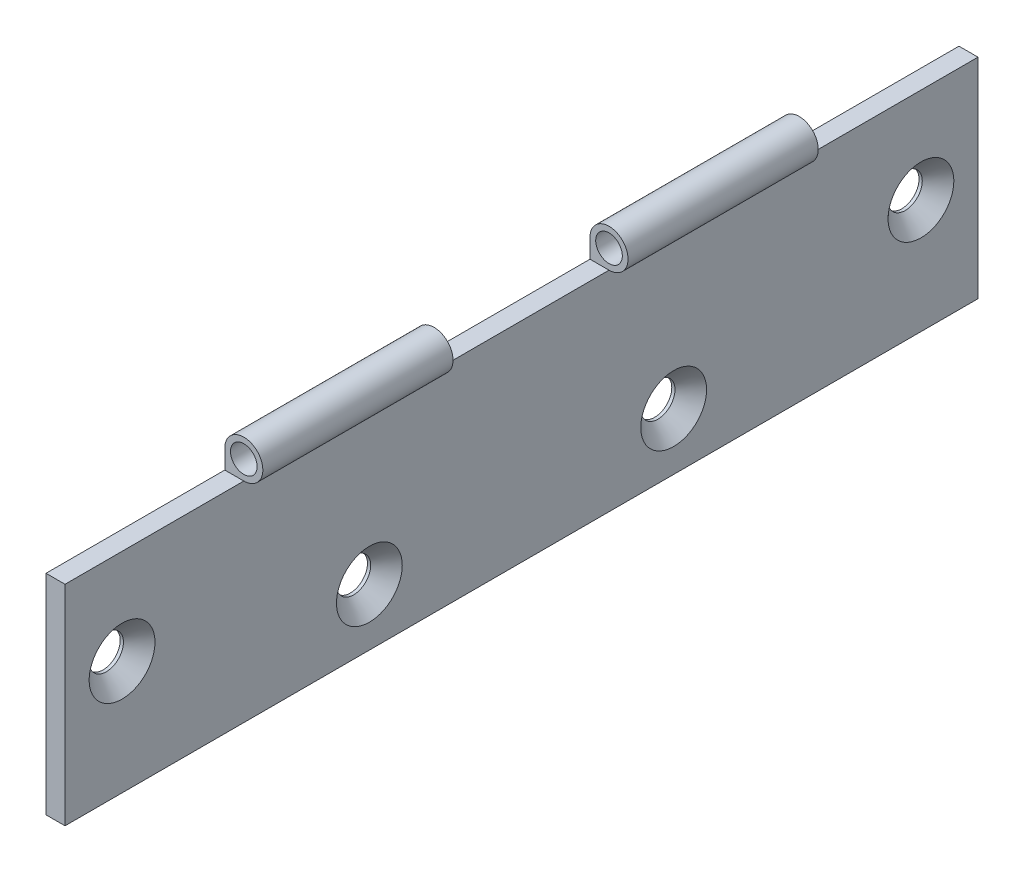
ISO-10303-21;
HEADER;
FILE_DESCRIPTION(('STEP AP214'),'2;1');
FILE_NAME('part.step','',(''),(''),'','','');
FILE_SCHEMA(('AUTOMOTIVE_DESIGN { 1 0 10303 214 1 1 1 1 }'));
ENDSEC;
DATA;
#1=APPLICATION_CONTEXT('core data for automotive mechanical design processes');
#2=APPLICATION_PROTOCOL_DEFINITION('international standard','automotive_design',2000,#1);
#3=PRODUCT_CONTEXT('',#1,'mechanical');
#4=PRODUCT('Part','Part','',(#3));
#5=PRODUCT_RELATED_PRODUCT_CATEGORY('part','',(#4));
#6=PRODUCT_DEFINITION_FORMATION('','',#4);
#7=PRODUCT_DEFINITION_CONTEXT('part definition',#1,'design');
#8=PRODUCT_DEFINITION('design','',#6,#7);
#9=PRODUCT_DEFINITION_SHAPE('','',#8);
#10=(LENGTH_UNIT() NAMED_UNIT(*) SI_UNIT(.MILLI.,.METRE.));
#11=(NAMED_UNIT(*) PLANE_ANGLE_UNIT() SI_UNIT($,.RADIAN.));
#12=(NAMED_UNIT(*) SI_UNIT($,.STERADIAN.) SOLID_ANGLE_UNIT());
#13=UNCERTAINTY_MEASURE_WITH_UNIT(LENGTH_MEASURE(1.E-05),#10,'distance_accuracy_value','');
#14=(GEOMETRIC_REPRESENTATION_CONTEXT(3) GLOBAL_UNCERTAINTY_ASSIGNED_CONTEXT((#13)) GLOBAL_UNIT_ASSIGNED_CONTEXT((#10,
#11,#12)) REPRESENTATION_CONTEXT('',''));
#15=CARTESIAN_POINT('',(0.,0.,0.));
#16=DIRECTION('',(0.,0.,1.));
#17=DIRECTION('',(1.,0.,0.));
#18=AXIS2_PLACEMENT_3D('',#15,#16,#17);
#19=CARTESIAN_POINT('',(0.,0.,120.));
#20=DIRECTION('',(-1.,0.,0.));
#21=DIRECTION('',(0.,0.,1.));
#22=AXIS2_PLACEMENT_3D('',#19,#20,#21);
#23=PLANE('',#22);
#24=CARTESIAN_POINT('',(0.,30.,-105.));
#25=DIRECTION('',(1.,0.,0.));
#26=DIRECTION('',(0.,0.,-1.));
#27=AXIS2_PLACEMENT_3D('',#24,#25,#26);
#28=CIRCLE('',#27,4.5);
#29=CARTESIAN_POINT('',(0.,30.,-109.5));
#30=VERTEX_POINT('',#29);
#31=EDGE_CURVE('E191',#30,#30,#28,.T.);
#32=ORIENTED_EDGE('',*,*,#31,.T.);
#33=EDGE_LOOP('',(#32));
#34=FACE_BOUND('',#33,.T.);
#35=CARTESIAN_POINT('',(0.,15.,-40.));
#36=DIRECTION('',(1.,0.,0.));
#37=DIRECTION('',(0.,0.,-1.));
#38=AXIS2_PLACEMENT_3D('',#35,#36,#37);
#39=CIRCLE('',#38,4.5);
#40=CARTESIAN_POINT('',(0.,15.,-44.5));
#41=VERTEX_POINT('',#40);
#42=EDGE_CURVE('E200',#41,#41,#39,.T.);
#43=ORIENTED_EDGE('',*,*,#42,.T.);
#44=EDGE_LOOP('',(#43));
#45=FACE_BOUND('',#44,.T.);
#46=CARTESIAN_POINT('',(0.,30.,105.));
#47=DIRECTION('',(1.,0.,0.));
#48=DIRECTION('',(0.,0.,-1.));
#49=AXIS2_PLACEMENT_3D('',#46,#47,#48);
#50=CIRCLE('',#49,4.5);
#51=CARTESIAN_POINT('',(0.,30.,100.5));
#52=VERTEX_POINT('',#51);
#53=EDGE_CURVE('E209',#52,#52,#50,.T.);
#54=ORIENTED_EDGE('',*,*,#53,.T.);
#55=EDGE_LOOP('',(#54));
#56=FACE_BOUND('',#55,.T.);
#57=CARTESIAN_POINT('',(0.,15.,40.));
#58=DIRECTION('',(1.,0.,0.));
#59=DIRECTION('',(0.,0.,-1.));
#60=AXIS2_PLACEMENT_3D('',#57,#58,#59);
#61=CIRCLE('',#60,4.5);
#62=CARTESIAN_POINT('',(0.,15.,35.5));
#63=VERTEX_POINT('',#62);
#64=EDGE_CURVE('E218',#63,#63,#61,.T.);
#65=ORIENTED_EDGE('',*,*,#64,.T.);
#66=EDGE_LOOP('',(#65));
#67=FACE_BOUND('',#66,.T.);
#68=DIRECTION('',(0.,0.,1.));
#69=VECTOR('',#68,1.);
#70=CARTESIAN_POINT('',(0.,55.,0.));
#71=LINE('',#70,#69);
#72=CARTESIAN_POINT('',(0.,55.,73.));
#73=VERTEX_POINT('',#72);
#74=CARTESIAN_POINT('',(0.,55.,120.));
#75=VERTEX_POINT('',#74);
#76=EDGE_CURVE('E114',#73,#75,#71,.T.);
#77=ORIENTED_EDGE('',*,*,#76,.F.);
#78=DIRECTION('',(0.,-1.,0.));
#79=VECTOR('',#78,1.);
#80=CARTESIAN_POINT('',(0.,0.,73.0000000000001));
#81=LINE('',#80,#79);
#82=CARTESIAN_POINT('',(0.,60.,73.));
#83=VERTEX_POINT('',#82);
#84=EDGE_CURVE('E121',#83,#73,#81,.T.);
#85=ORIENTED_EDGE('',*,*,#84,.F.);
#86=DIRECTION('',(0.,0.,-1.));
#87=VECTOR('',#86,1.);
#88=CARTESIAN_POINT('',(0.,60.,120.));
#89=LINE('',#88,#87);
#90=CARTESIAN_POINT('',(0.,60.,23.));
#91=VERTEX_POINT('',#90);
#92=EDGE_CURVE('E11',#83,#91,#89,.T.);
#93=ORIENTED_EDGE('',*,*,#92,.T.);
#94=DIRECTION('',(0.,-1.,0.));
#95=VECTOR('',#94,1.);
#96=CARTESIAN_POINT('',(0.,0.,23.));
#97=LINE('',#96,#95);
#98=CARTESIAN_POINT('',(0.,55.,23.));
#99=VERTEX_POINT('',#98);
#100=EDGE_CURVE('E244',#91,#99,#97,.T.);
#101=ORIENTED_EDGE('',*,*,#100,.T.);
#102=DIRECTION('',(0.,0.,1.));
#103=VECTOR('',#102,1.);
#104=CARTESIAN_POINT('',(0.,55.,0.));
#105=LINE('',#104,#103);
#106=CARTESIAN_POINT('',(0.,55.,-23.));
#107=VERTEX_POINT('',#106);
#108=EDGE_CURVE('E241',#107,#99,#105,.T.);
#109=ORIENTED_EDGE('',*,*,#108,.F.);
#110=DIRECTION('',(0.,-1.,0.));
#111=VECTOR('',#110,1.);
#112=CARTESIAN_POINT('',(0.,0.,-23.));
#113=LINE('',#112,#111);
#114=CARTESIAN_POINT('',(0.,60.,-23.));
#115=VERTEX_POINT('',#114);
#116=EDGE_CURVE('E240',#115,#107,#113,.T.);
#117=ORIENTED_EDGE('',*,*,#116,.F.);
#118=CARTESIAN_POINT('',(0.,60.,-73.));
#119=VERTEX_POINT('',#118);
#120=EDGE_CURVE('E43',#115,#119,#89,.T.);
#121=ORIENTED_EDGE('',*,*,#120,.T.);
#122=DIRECTION('',(0.,-1.,0.));
#123=VECTOR('',#122,1.);
#124=CARTESIAN_POINT('',(0.,0.,-73.0000000000001));
#125=LINE('',#124,#123);
#126=CARTESIAN_POINT('',(0.,55.,-73.));
#127=VERTEX_POINT('',#126);
#128=EDGE_CURVE('E163',#119,#127,#125,.T.);
#129=ORIENTED_EDGE('',*,*,#128,.T.);
#130=DIRECTION('',(0.,0.,1.));
#131=VECTOR('',#130,1.);
#132=CARTESIAN_POINT('',(0.,55.,0.));
#133=LINE('',#132,#131);
#134=CARTESIAN_POINT('',(0.,55.,-120.));
#135=VERTEX_POINT('',#134);
#136=EDGE_CURVE('E177',#135,#127,#133,.T.);
#137=ORIENTED_EDGE('',*,*,#136,.F.);
#138=DIRECTION('',(0.,1.,0.));
#139=VECTOR('',#138,1.);
#140=CARTESIAN_POINT('',(0.,0.,-120.));
#141=LINE('',#140,#139);
#142=CARTESIAN_POINT('',(0.,0.,-120.));
#143=VERTEX_POINT('',#142);
#144=EDGE_CURVE('E141',#143,#135,#141,.T.);
#145=ORIENTED_EDGE('',*,*,#144,.F.);
#146=DIRECTION('',(0.,0.,-1.));
#147=VECTOR('',#146,1.);
#148=CARTESIAN_POINT('',(0.,0.,120.));
#149=LINE('',#148,#147);
#150=CARTESIAN_POINT('',(0.,0.,120.));
#151=VERTEX_POINT('',#150);
#152=EDGE_CURVE('E60',#151,#143,#149,.T.);
#153=ORIENTED_EDGE('',*,*,#152,.F.);
#154=DIRECTION('',(0.,1.,0.));
#155=VECTOR('',#154,1.);
#156=CARTESIAN_POINT('',(0.,0.,120.));
#157=LINE('',#156,#155);
#158=EDGE_CURVE('E128',#151,#75,#157,.T.);
#159=ORIENTED_EDGE('',*,*,#158,.T.);
#160=EDGE_LOOP('',(#77,#85,#93,#101,#109,#117,#121,#129,#137,#145,#153,#159));
#161=FACE_BOUND('',#160,.T.);
#162=ADVANCED_FACE('F33',(#34,#45,#56,#67,#161),#23,.T.);
#163=CARTESIAN_POINT('',(0.,0.,120.));
#164=DIRECTION('',(0.,0.,-1.));
#165=DIRECTION('',(-1.,0.,0.));
#166=AXIS2_PLACEMENT_3D('',#163,#164,#165);
#167=PLANE('',#166);
#168=DIRECTION('',(1.,0.,0.));
#169=VECTOR('',#168,1.);
#170=CARTESIAN_POINT('',(0.,55.,120.));
#171=LINE('',#170,#169);
#172=CARTESIAN_POINT('',(5.,55.,120.));
#173=VERTEX_POINT('',#172);
#174=EDGE_CURVE('E68',#75,#173,#171,.T.);
#175=ORIENTED_EDGE('',*,*,#174,.F.);
#176=ORIENTED_EDGE('',*,*,#158,.F.);
#177=DIRECTION('',(-1.,0.,0.));
#178=VECTOR('',#177,1.);
#179=CARTESIAN_POINT('',(5.,0.,120.));
#180=LINE('',#179,#178);
#181=CARTESIAN_POINT('',(5.,0.,120.));
#182=VERTEX_POINT('',#181);
#183=EDGE_CURVE('E131',#182,#151,#180,.T.);
#184=ORIENTED_EDGE('',*,*,#183,.F.);
#185=DIRECTION('',(0.,1.,0.));
#186=VECTOR('',#185,1.);
#187=CARTESIAN_POINT('',(5.,0.,120.));
#188=LINE('',#187,#186);
#189=EDGE_CURVE('E129',#182,#173,#188,.T.);
#190=ORIENTED_EDGE('',*,*,#189,.T.);
#191=EDGE_LOOP('',(#175,#176,#184,#190));
#192=FACE_BOUND('',#191,.T.);
#193=ADVANCED_FACE('F126',(#192),#167,.F.);
#194=CARTESIAN_POINT('',(5.,60.,-120.));
#195=DIRECTION('',(0.,0.,1.));
#196=DIRECTION('',(1.,0.,0.));
#197=AXIS2_PLACEMENT_3D('',#194,#195,#196);
#198=CYLINDRICAL_SURFACE('',#197,5.);
#199=ORIENTED_EDGE('',*,*,#92,.F.);
#200=CARTESIAN_POINT('',(5.,60.,73.));
#201=DIRECTION('',(0.,0.,1.));
#202=DIRECTION('',(0.,-1.,0.));
#203=AXIS2_PLACEMENT_3D('',#200,#201,#202);
#204=CIRCLE('',#203,5.);
#205=CARTESIAN_POINT('',(5.,55.,73.));
#206=VERTEX_POINT('',#205);
#207=EDGE_CURVE('E248',#83,#206,#204,.F.);
#208=ORIENTED_EDGE('',*,*,#207,.T.);
#209=DIRECTION('',(0.,0.,1.));
#210=VECTOR('',#209,1.);
#211=CARTESIAN_POINT('',(5.,55.,-120.));
#212=LINE('',#211,#210);
#213=CARTESIAN_POINT('',(5.,55.,23.));
#214=VERTEX_POINT('',#213);
#215=EDGE_CURVE('E226',#214,#206,#212,.T.);
#216=ORIENTED_EDGE('',*,*,#215,.F.);
#217=CARTESIAN_POINT('',(5.,60.,23.));
#218=DIRECTION('',(0.,0.,1.));
#219=DIRECTION('',(1.,0.,0.));
#220=AXIS2_PLACEMENT_3D('',#217,#218,#219);
#221=CIRCLE('',#220,5.);
#222=EDGE_CURVE('E156',#91,#214,#221,.F.);
#223=ORIENTED_EDGE('',*,*,#222,.F.);
#224=EDGE_LOOP('',(#199,#208,#216,#223));
#225=FACE_BOUND('',#224,.T.);
#226=ADVANCED_FACE('F256',(#225),#198,.T.);
#227=CARTESIAN_POINT('',(5.,60.,-120.));
#228=DIRECTION('',(0.,0.,1.));
#229=DIRECTION('',(1.,0.,0.));
#230=AXIS2_PLACEMENT_3D('',#227,#228,#229);
#231=CYLINDRICAL_SURFACE('',#230,3.5);
#232=CARTESIAN_POINT('',(5.,60.,23.));
#233=DIRECTION('',(0.,0.,1.));
#234=DIRECTION('',(1.,0.,0.));
#235=AXIS2_PLACEMENT_3D('',#232,#233,#234);
#236=CIRCLE('',#235,3.5);
#237=CARTESIAN_POINT('',(8.5,60.,23.));
#238=VERTEX_POINT('',#237);
#239=EDGE_CURVE('E154',#238,#238,#236,.F.);
#240=ORIENTED_EDGE('',*,*,#239,.T.);
#241=EDGE_LOOP('',(#240));
#242=FACE_BOUND('',#241,.T.);
#243=CARTESIAN_POINT('',(5.,60.,73.));
#244=DIRECTION('',(0.,0.,1.));
#245=DIRECTION('',(0.,-1.,0.));
#246=AXIS2_PLACEMENT_3D('',#243,#244,#245);
#247=CIRCLE('',#246,3.5);
#248=CARTESIAN_POINT('',(5.,56.5,73.));
#249=VERTEX_POINT('',#248);
#250=EDGE_CURVE('E37',#249,#249,#247,.F.);
#251=ORIENTED_EDGE('',*,*,#250,.F.);
#252=EDGE_LOOP('',(#251));
#253=FACE_BOUND('',#252,.T.);
#254=ADVANCED_FACE('F317',(#242,#253),#231,.F.);
#255=ORIENTED_EDGE('',*,*,#120,.F.);
#256=CARTESIAN_POINT('',(5.,60.,-23.));
#257=DIRECTION('',(0.,0.,1.));
#258=DIRECTION('',(0.,-1.,0.));
#259=AXIS2_PLACEMENT_3D('',#256,#257,#258);
#260=CIRCLE('',#259,5.);
#261=CARTESIAN_POINT('',(5.,55.,-23.));
#262=VERTEX_POINT('',#261);
#263=EDGE_CURVE('E160',#115,#262,#260,.F.);
#264=ORIENTED_EDGE('',*,*,#263,.T.);
#265=CARTESIAN_POINT('',(5.,55.,-73.));
#266=VERTEX_POINT('',#265);
#267=EDGE_CURVE('E222',#266,#262,#212,.T.);
#268=ORIENTED_EDGE('',*,*,#267,.F.);
#269=CARTESIAN_POINT('',(5.,60.,-73.));
#270=DIRECTION('',(0.,0.,1.));
#271=DIRECTION('',(0.,-1.,0.));
#272=AXIS2_PLACEMENT_3D('',#269,#270,#271);
#273=CIRCLE('',#272,5.);
#274=EDGE_CURVE('E152',#119,#266,#273,.F.);
#275=ORIENTED_EDGE('',*,*,#274,.F.);
#276=EDGE_LOOP('',(#255,#264,#268,#275));
#277=FACE_BOUND('',#276,.T.);
#278=ADVANCED_FACE('F263',(#277),#198,.T.);
#279=CARTESIAN_POINT('',(5.,60.,-73.));
#280=DIRECTION('',(0.,0.,1.));
#281=DIRECTION('',(0.,-1.,0.));
#282=AXIS2_PLACEMENT_3D('',#279,#280,#281);
#283=CIRCLE('',#282,3.5);
#284=CARTESIAN_POINT('',(5.,56.5,-73.));
#285=VERTEX_POINT('',#284);
#286=EDGE_CURVE('E149',#285,#285,#283,.F.);
#287=ORIENTED_EDGE('',*,*,#286,.T.);
#288=EDGE_LOOP('',(#287));
#289=FACE_BOUND('',#288,.T.);
#290=CARTESIAN_POINT('',(5.,60.,-23.));
#291=DIRECTION('',(0.,0.,1.));
#292=DIRECTION('',(0.,-1.,0.));
#293=AXIS2_PLACEMENT_3D('',#290,#291,#292);
#294=CIRCLE('',#293,3.5);
#295=CARTESIAN_POINT('',(5.,56.5,-23.));
#296=VERTEX_POINT('',#295);
#297=EDGE_CURVE('E158',#296,#296,#294,.F.);
#298=ORIENTED_EDGE('',*,*,#297,.F.);
#299=EDGE_LOOP('',(#298));
#300=FACE_BOUND('',#299,.T.);
#301=ADVANCED_FACE('F321',(#289,#300),#231,.F.);
#302=CARTESIAN_POINT('',(0.,0.,-120.));
#303=DIRECTION('',(0.,0.,-1.));
#304=DIRECTION('',(-1.,0.,0.));
#305=AXIS2_PLACEMENT_3D('',#302,#303,#304);
#306=PLANE('',#305);
#307=ORIENTED_EDGE('',*,*,#144,.T.);
#308=DIRECTION('',(1.,0.,0.));
#309=VECTOR('',#308,1.);
#310=CARTESIAN_POINT('',(0.,55.,-120.));
#311=LINE('',#310,#309);
#312=CARTESIAN_POINT('',(5.,55.,-120.));
#313=VERTEX_POINT('',#312);
#314=EDGE_CURVE('E153',#135,#313,#311,.T.);
#315=ORIENTED_EDGE('',*,*,#314,.T.);
#316=DIRECTION('',(0.,1.,0.));
#317=VECTOR('',#316,1.);
#318=CARTESIAN_POINT('',(5.,0.,-120.));
#319=LINE('',#318,#317);
#320=CARTESIAN_POINT('',(5.,0.,-120.));
#321=VERTEX_POINT('',#320);
#322=EDGE_CURVE('E138',#321,#313,#319,.T.);
#323=ORIENTED_EDGE('',*,*,#322,.F.);
#324=DIRECTION('',(-1.,0.,0.));
#325=VECTOR('',#324,1.);
#326=CARTESIAN_POINT('',(5.,0.,-120.));
#327=LINE('',#326,#325);
#328=EDGE_CURVE('E134',#321,#143,#327,.T.);
#329=ORIENTED_EDGE('',*,*,#328,.T.);
#330=EDGE_LOOP('',(#307,#315,#323,#329));
#331=FACE_BOUND('',#330,.T.);
#332=ADVANCED_FACE('F272',(#331),#306,.T.);
#333=CARTESIAN_POINT('',(5.,0.,120.));
#334=DIRECTION('',(-1.,0.,0.));
#335=DIRECTION('',(0.,0.,1.));
#336=AXIS2_PLACEMENT_3D('',#333,#334,#335);
#337=PLANE('',#336);
#338=CARTESIAN_POINT('',(5.,30.,-105.));
#339=DIRECTION('',(1.,0.,0.));
#340=DIRECTION('',(0.,0.,-1.));
#341=AXIS2_PLACEMENT_3D('',#338,#339,#340);
#342=CIRCLE('',#341,8.65);
#343=CARTESIAN_POINT('',(5.,30.,-113.65));
#344=VERTEX_POINT('',#343);
#345=EDGE_CURVE('E185',#344,#344,#342,.T.);
#346=ORIENTED_EDGE('',*,*,#345,.F.);
#347=EDGE_LOOP('',(#346));
#348=FACE_BOUND('',#347,.T.);
#349=CARTESIAN_POINT('',(5.,15.,-40.));
#350=DIRECTION('',(1.,0.,0.));
#351=DIRECTION('',(0.,0.,-1.));
#352=AXIS2_PLACEMENT_3D('',#349,#350,#351);
#353=CIRCLE('',#352,8.65);
#354=CARTESIAN_POINT('',(5.,15.,-48.65));
#355=VERTEX_POINT('',#354);
#356=EDGE_CURVE('E194',#355,#355,#353,.T.);
#357=ORIENTED_EDGE('',*,*,#356,.F.);
#358=EDGE_LOOP('',(#357));
#359=FACE_BOUND('',#358,.T.);
#360=CARTESIAN_POINT('',(5.,30.,105.));
#361=DIRECTION('',(1.,0.,0.));
#362=DIRECTION('',(0.,0.,-1.));
#363=AXIS2_PLACEMENT_3D('',#360,#361,#362);
#364=CIRCLE('',#363,8.65);
#365=CARTESIAN_POINT('',(5.,30.,96.35));
#366=VERTEX_POINT('',#365);
#367=EDGE_CURVE('E203',#366,#366,#364,.T.);
#368=ORIENTED_EDGE('',*,*,#367,.F.);
#369=EDGE_LOOP('',(#368));
#370=FACE_BOUND('',#369,.T.);
#371=CARTESIAN_POINT('',(5.,15.,40.));
#372=DIRECTION('',(1.,0.,0.));
#373=DIRECTION('',(0.,0.,-1.));
#374=AXIS2_PLACEMENT_3D('',#371,#372,#373);
#375=CIRCLE('',#374,8.65);
#376=CARTESIAN_POINT('',(5.,15.,31.35));
#377=VERTEX_POINT('',#376);
#378=EDGE_CURVE('E212',#377,#377,#375,.T.);
#379=ORIENTED_EDGE('',*,*,#378,.F.);
#380=EDGE_LOOP('',(#379));
#381=FACE_BOUND('',#380,.T.);
#382=ORIENTED_EDGE('',*,*,#322,.T.);
#383=EDGE_CURVE('E142',#313,#266,#212,.T.);
#384=ORIENTED_EDGE('',*,*,#383,.T.);
#385=ORIENTED_EDGE('',*,*,#267,.T.);
#386=EDGE_CURVE('E225',#262,#214,#212,.T.);
#387=ORIENTED_EDGE('',*,*,#386,.T.);
#388=ORIENTED_EDGE('',*,*,#215,.T.);
#389=EDGE_CURVE('E220',#206,#173,#212,.T.);
#390=ORIENTED_EDGE('',*,*,#389,.T.);
#391=ORIENTED_EDGE('',*,*,#189,.F.);
#392=DIRECTION('',(0.,0.,-1.));
#393=VECTOR('',#392,1.);
#394=CARTESIAN_POINT('',(5.,0.,120.));
#395=LINE('',#394,#393);
#396=EDGE_CURVE('E52',#182,#321,#395,.T.);
#397=ORIENTED_EDGE('',*,*,#396,.T.);
#398=EDGE_LOOP('',(#382,#384,#385,#387,#388,#390,#391,#397));
#399=FACE_BOUND('',#398,.T.);
#400=ADVANCED_FACE('F35',(#348,#359,#370,#381,#399),#337,.F.);
#401=CARTESIAN_POINT('',(5.,0.,120.));
#402=DIRECTION('',(0.,-1.,0.));
#403=DIRECTION('',(0.,0.,-1.));
#404=AXIS2_PLACEMENT_3D('',#401,#402,#403);
#405=PLANE('',#404);
#406=ORIENTED_EDGE('',*,*,#328,.F.);
#407=ORIENTED_EDGE('',*,*,#396,.F.);
#408=ORIENTED_EDGE('',*,*,#183,.T.);
#409=ORIENTED_EDGE('',*,*,#152,.T.);
#410=EDGE_LOOP('',(#406,#407,#408,#409));
#411=FACE_BOUND('',#410,.T.);
#412=ADVANCED_FACE('F274',(#411),#405,.T.);
#413=CARTESIAN_POINT('',(5.,15.,40.));
#414=DIRECTION('',(1.,0.,0.));
#415=DIRECTION('',(0.,0.,-1.));
#416=AXIS2_PLACEMENT_3D('',#413,#414,#415);
#417=CYLINDRICAL_SURFACE('',#416,4.5);
#418=ORIENTED_EDGE('',*,*,#64,.F.);
#419=EDGE_LOOP('',(#418));
#420=FACE_BOUND('',#419,.T.);
#421=CARTESIAN_POINT('',(0.850000000000003,15.,40.));
#422=DIRECTION('',(1.,0.,0.));
#423=DIRECTION('',(0.,0.,-1.));
#424=AXIS2_PLACEMENT_3D('',#421,#422,#423);
#425=CIRCLE('',#424,4.5);
#426=CARTESIAN_POINT('',(0.850000000000003,15.,35.5));
#427=VERTEX_POINT('',#426);
#428=EDGE_CURVE('E215',#427,#427,#425,.T.);
#429=ORIENTED_EDGE('',*,*,#428,.T.);
#430=EDGE_LOOP('',(#429));
#431=FACE_BOUND('',#430,.T.);
#432=ADVANCED_FACE('F276',(#420,#431),#417,.F.);
#433=CARTESIAN_POINT('',(5.,15.,40.));
#434=DIRECTION('',(1.,0.,0.));
#435=DIRECTION('',(0.,0.,-1.));
#436=AXIS2_PLACEMENT_3D('',#433,#434,#435);
#437=CONICAL_SURFACE('',#436,8.65,0.785398163397448);
#438=ORIENTED_EDGE('',*,*,#428,.F.);
#439=EDGE_LOOP('',(#438));
#440=FACE_BOUND('',#439,.T.);
#441=ORIENTED_EDGE('',*,*,#378,.T.);
#442=EDGE_LOOP('',(#441));
#443=FACE_BOUND('',#442,.T.);
#444=ADVANCED_FACE('F282',(#440,#443),#437,.F.);
#445=CARTESIAN_POINT('',(5.,30.,105.));
#446=DIRECTION('',(1.,0.,0.));
#447=DIRECTION('',(0.,0.,-1.));
#448=AXIS2_PLACEMENT_3D('',#445,#446,#447);
#449=CYLINDRICAL_SURFACE('',#448,4.5);
#450=ORIENTED_EDGE('',*,*,#53,.F.);
#451=EDGE_LOOP('',(#450));
#452=FACE_BOUND('',#451,.T.);
#453=CARTESIAN_POINT('',(0.850000000000003,30.,105.));
#454=DIRECTION('',(1.,0.,0.));
#455=DIRECTION('',(0.,0.,-1.));
#456=AXIS2_PLACEMENT_3D('',#453,#454,#455);
#457=CIRCLE('',#456,4.5);
#458=CARTESIAN_POINT('',(0.850000000000003,30.,100.5));
#459=VERTEX_POINT('',#458);
#460=EDGE_CURVE('E206',#459,#459,#457,.T.);
#461=ORIENTED_EDGE('',*,*,#460,.T.);
#462=EDGE_LOOP('',(#461));
#463=FACE_BOUND('',#462,.T.);
#464=ADVANCED_FACE('F305',(#452,#463),#449,.F.);
#465=CARTESIAN_POINT('',(5.,30.,105.));
#466=DIRECTION('',(1.,0.,0.));
#467=DIRECTION('',(0.,0.,-1.));
#468=AXIS2_PLACEMENT_3D('',#465,#466,#467);
#469=CONICAL_SURFACE('',#468,8.65,0.785398163397449);
#470=ORIENTED_EDGE('',*,*,#460,.F.);
#471=EDGE_LOOP('',(#470));
#472=FACE_BOUND('',#471,.T.);
#473=ORIENTED_EDGE('',*,*,#367,.T.);
#474=EDGE_LOOP('',(#473));
#475=FACE_BOUND('',#474,.T.);
#476=ADVANCED_FACE('F312',(#472,#475),#469,.F.);
#477=CARTESIAN_POINT('',(5.,15.,-40.));
#478=DIRECTION('',(1.,0.,0.));
#479=DIRECTION('',(0.,0.,-1.));
#480=AXIS2_PLACEMENT_3D('',#477,#478,#479);
#481=CYLINDRICAL_SURFACE('',#480,4.5);
#482=ORIENTED_EDGE('',*,*,#42,.F.);
#483=EDGE_LOOP('',(#482));
#484=FACE_BOUND('',#483,.T.);
#485=CARTESIAN_POINT('',(0.850000000000003,15.,-40.));
#486=DIRECTION('',(1.,0.,0.));
#487=DIRECTION('',(0.,0.,-1.));
#488=AXIS2_PLACEMENT_3D('',#485,#486,#487);
#489=CIRCLE('',#488,4.5);
#490=CARTESIAN_POINT('',(0.850000000000003,15.,-44.5));
#491=VERTEX_POINT('',#490);
#492=EDGE_CURVE('E197',#491,#491,#489,.T.);
#493=ORIENTED_EDGE('',*,*,#492,.T.);
#494=EDGE_LOOP('',(#493));
#495=FACE_BOUND('',#494,.T.);
#496=ADVANCED_FACE('F354',(#484,#495),#481,.F.);
#497=CARTESIAN_POINT('',(5.,15.,-40.));
#498=DIRECTION('',(1.,0.,0.));
#499=DIRECTION('',(0.,0.,-1.));
#500=AXIS2_PLACEMENT_3D('',#497,#498,#499);
#501=CONICAL_SURFACE('',#500,8.65,0.785398163397448);
#502=ORIENTED_EDGE('',*,*,#492,.F.);
#503=EDGE_LOOP('',(#502));
#504=FACE_BOUND('',#503,.T.);
#505=ORIENTED_EDGE('',*,*,#356,.T.);
#506=EDGE_LOOP('',(#505));
#507=FACE_BOUND('',#506,.T.);
#508=ADVANCED_FACE('F350',(#504,#507),#501,.F.);
#509=CARTESIAN_POINT('',(5.,30.,-105.));
#510=DIRECTION('',(1.,0.,0.));
#511=DIRECTION('',(0.,0.,-1.));
#512=AXIS2_PLACEMENT_3D('',#509,#510,#511);
#513=CYLINDRICAL_SURFACE('',#512,4.5);
#514=ORIENTED_EDGE('',*,*,#31,.F.);
#515=EDGE_LOOP('',(#514));
#516=FACE_BOUND('',#515,.T.);
#517=CARTESIAN_POINT('',(0.850000000000003,30.,-105.));
#518=DIRECTION('',(1.,0.,0.));
#519=DIRECTION('',(0.,0.,-1.));
#520=AXIS2_PLACEMENT_3D('',#517,#518,#519);
#521=CIRCLE('',#520,4.5);
#522=CARTESIAN_POINT('',(0.850000000000003,30.,-109.5));
#523=VERTEX_POINT('',#522);
#524=EDGE_CURVE('E188',#523,#523,#521,.T.);
#525=ORIENTED_EDGE('',*,*,#524,.T.);
#526=EDGE_LOOP('',(#525));
#527=FACE_BOUND('',#526,.T.);
#528=ADVANCED_FACE('F346',(#516,#527),#513,.F.);
#529=CARTESIAN_POINT('',(5.,30.,-105.));
#530=DIRECTION('',(1.,0.,0.));
#531=DIRECTION('',(0.,0.,-1.));
#532=AXIS2_PLACEMENT_3D('',#529,#530,#531);
#533=CONICAL_SURFACE('',#532,8.65,0.785398163397449);
#534=ORIENTED_EDGE('',*,*,#524,.F.);
#535=EDGE_LOOP('',(#534));
#536=FACE_BOUND('',#535,.T.);
#537=ORIENTED_EDGE('',*,*,#345,.T.);
#538=EDGE_LOOP('',(#537));
#539=FACE_BOUND('',#538,.T.);
#540=ADVANCED_FACE('F340',(#536,#539),#533,.F.);
#541=CARTESIAN_POINT('',(0.,55.,0.));
#542=DIRECTION('',(0.,1.,0.));
#543=DIRECTION('',(0.,0.,1.));
#544=AXIS2_PLACEMENT_3D('',#541,#542,#543);
#545=PLANE('',#544);
#546=ORIENTED_EDGE('',*,*,#383,.F.);
#547=ORIENTED_EDGE('',*,*,#314,.F.);
#548=ORIENTED_EDGE('',*,*,#136,.T.);
#549=DIRECTION('',(1.,0.,0.));
#550=VECTOR('',#549,1.);
#551=CARTESIAN_POINT('',(0.,55.,-73.));
#552=LINE('',#551,#550);
#553=EDGE_CURVE('E179',#127,#266,#552,.T.);
#554=ORIENTED_EDGE('',*,*,#553,.T.);
#555=EDGE_LOOP('',(#546,#547,#548,#554));
#556=FACE_BOUND('',#555,.T.);
#557=ADVANCED_FACE('F269',(#556),#545,.T.);
#558=CARTESIAN_POINT('',(0.,0.,-73.0000000000001));
#559=DIRECTION('',(0.,0.,1.));
#560=DIRECTION('',(0.,-1.,0.));
#561=AXIS2_PLACEMENT_3D('',#558,#559,#560);
#562=PLANE('',#561);
#563=ORIENTED_EDGE('',*,*,#274,.T.);
#564=ORIENTED_EDGE('',*,*,#553,.F.);
#565=ORIENTED_EDGE('',*,*,#128,.F.);
#566=EDGE_LOOP('',(#563,#564,#565));
#567=FACE_BOUND('',#566,.T.);
#568=ORIENTED_EDGE('',*,*,#286,.F.);
#569=EDGE_LOOP('',(#568));
#570=FACE_BOUND('',#569,.T.);
#571=ADVANCED_FACE('F266',(#567,#570),#562,.F.);
#572=CARTESIAN_POINT('',(0.,55.,0.));
#573=DIRECTION('',(0.,1.,0.));
#574=DIRECTION('',(0.,0.,1.));
#575=AXIS2_PLACEMENT_3D('',#572,#573,#574);
#576=PLANE('',#575);
#577=ORIENTED_EDGE('',*,*,#386,.F.);
#578=DIRECTION('',(1.,0.,0.));
#579=VECTOR('',#578,1.);
#580=CARTESIAN_POINT('',(0.,55.,-23.));
#581=LINE('',#580,#579);
#582=EDGE_CURVE('E157',#107,#262,#581,.T.);
#583=ORIENTED_EDGE('',*,*,#582,.F.);
#584=ORIENTED_EDGE('',*,*,#108,.T.);
#585=DIRECTION('',(1.,0.,0.));
#586=VECTOR('',#585,1.);
#587=CARTESIAN_POINT('',(0.,55.,23.));
#588=LINE('',#587,#586);
#589=EDGE_CURVE('E172',#99,#214,#588,.T.);
#590=ORIENTED_EDGE('',*,*,#589,.T.);
#591=EDGE_LOOP('',(#577,#583,#584,#590));
#592=FACE_BOUND('',#591,.T.);
#593=ADVANCED_FACE('F235',(#592),#576,.T.);
#594=CARTESIAN_POINT('',(0.,0.,-23.));
#595=DIRECTION('',(0.,0.,1.));
#596=DIRECTION('',(0.,-1.,0.));
#597=AXIS2_PLACEMENT_3D('',#594,#595,#596);
#598=PLANE('',#597);
#599=ORIENTED_EDGE('',*,*,#116,.T.);
#600=ORIENTED_EDGE('',*,*,#582,.T.);
#601=ORIENTED_EDGE('',*,*,#263,.F.);
#602=EDGE_LOOP('',(#599,#600,#601));
#603=FACE_BOUND('',#602,.T.);
#604=ORIENTED_EDGE('',*,*,#297,.T.);
#605=EDGE_LOOP('',(#604));
#606=FACE_BOUND('',#605,.T.);
#607=ADVANCED_FACE('F238',(#603,#606),#598,.T.);
#608=CARTESIAN_POINT('',(0.,0.,23.));
#609=DIRECTION('',(0.,0.,1.));
#610=DIRECTION('',(1.,0.,0.));
#611=AXIS2_PLACEMENT_3D('',#608,#609,#610);
#612=PLANE('',#611);
#613=ORIENTED_EDGE('',*,*,#222,.T.);
#614=ORIENTED_EDGE('',*,*,#589,.F.);
#615=ORIENTED_EDGE('',*,*,#100,.F.);
#616=EDGE_LOOP('',(#613,#614,#615));
#617=FACE_BOUND('',#616,.T.);
#618=ORIENTED_EDGE('',*,*,#239,.F.);
#619=EDGE_LOOP('',(#618));
#620=FACE_BOUND('',#619,.T.);
#621=ADVANCED_FACE('F257',(#617,#620),#612,.F.);
#622=CARTESIAN_POINT('',(0.,55.,0.));
#623=DIRECTION('',(0.,1.,0.));
#624=DIRECTION('',(0.,0.,1.));
#625=AXIS2_PLACEMENT_3D('',#622,#623,#624);
#626=PLANE('',#625);
#627=ORIENTED_EDGE('',*,*,#389,.F.);
#628=DIRECTION('',(1.,0.,0.));
#629=VECTOR('',#628,1.);
#630=CARTESIAN_POINT('',(0.,55.,73.));
#631=LINE('',#630,#629);
#632=EDGE_CURVE('E117',#73,#206,#631,.T.);
#633=ORIENTED_EDGE('',*,*,#632,.F.);
#634=ORIENTED_EDGE('',*,*,#76,.T.);
#635=ORIENTED_EDGE('',*,*,#174,.T.);
#636=EDGE_LOOP('',(#627,#633,#634,#635));
#637=FACE_BOUND('',#636,.T.);
#638=ADVANCED_FACE('F115',(#637),#626,.T.);
#639=CARTESIAN_POINT('',(0.,0.,73.0000000000001));
#640=DIRECTION('',(0.,0.,1.));
#641=DIRECTION('',(0.,-1.,0.));
#642=AXIS2_PLACEMENT_3D('',#639,#640,#641);
#643=PLANE('',#642);
#644=ORIENTED_EDGE('',*,*,#84,.T.);
#645=ORIENTED_EDGE('',*,*,#632,.T.);
#646=ORIENTED_EDGE('',*,*,#207,.F.);
#647=EDGE_LOOP('',(#644,#645,#646));
#648=FACE_BOUND('',#647,.T.);
#649=ORIENTED_EDGE('',*,*,#250,.T.);
#650=EDGE_LOOP('',(#649));
#651=FACE_BOUND('',#650,.T.);
#652=ADVANCED_FACE('F252',(#648,#651),#643,.T.);
#653=CLOSED_SHELL('',(#162,#193,#226,#254,#278,#301,#332,#400,#412,#432,#444,#464,#476,#496,
#508,#528,#540,#557,#571,#593,#607,#621,#638,#652));
#654=MANIFOLD_SOLID_BREP('B2',#653);
#655=ADVANCED_BREP_SHAPE_REPRESENTATION('',(#18,#654),#14);
#656=SHAPE_DEFINITION_REPRESENTATION(#9,#655);
ENDSEC;
END-ISO-10303-21;
